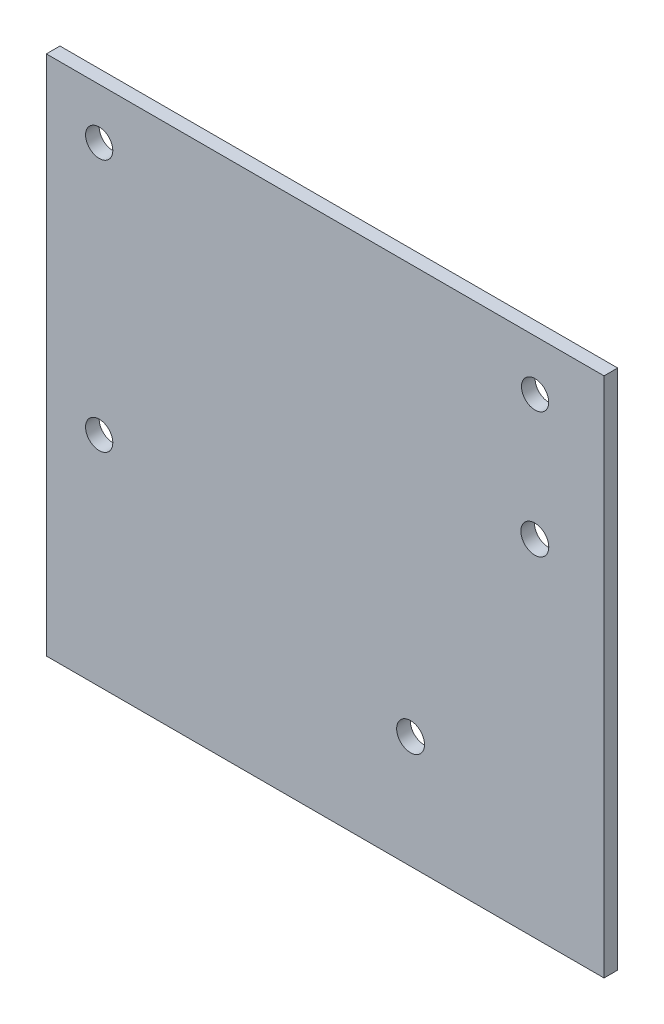
ISO-10303-21;
HEADER;
FILE_DESCRIPTION(('STEP AP214'),'2;1');
FILE_NAME('part.step','',(''),(''),'','','');
FILE_SCHEMA(('AUTOMOTIVE_DESIGN { 1 0 10303 214 1 1 1 1 }'));
ENDSEC;
DATA;
#1=APPLICATION_CONTEXT('core data for automotive mechanical design processes');
#2=APPLICATION_PROTOCOL_DEFINITION('international standard','automotive_design',2000,#1);
#3=PRODUCT_CONTEXT('',#1,'mechanical');
#4=PRODUCT('Part','Part','',(#3));
#5=PRODUCT_RELATED_PRODUCT_CATEGORY('part','',(#4));
#6=PRODUCT_DEFINITION_FORMATION('','',#4);
#7=PRODUCT_DEFINITION_CONTEXT('part definition',#1,'design');
#8=PRODUCT_DEFINITION('design','',#6,#7);
#9=PRODUCT_DEFINITION_SHAPE('','',#8);
#10=(LENGTH_UNIT() NAMED_UNIT(*) SI_UNIT(.MILLI.,.METRE.));
#11=(NAMED_UNIT(*) PLANE_ANGLE_UNIT() SI_UNIT($,.RADIAN.));
#12=(NAMED_UNIT(*) SI_UNIT($,.STERADIAN.) SOLID_ANGLE_UNIT());
#13=UNCERTAINTY_MEASURE_WITH_UNIT(LENGTH_MEASURE(1.E-05),#10,'distance_accuracy_value','');
#14=(GEOMETRIC_REPRESENTATION_CONTEXT(3) GLOBAL_UNCERTAINTY_ASSIGNED_CONTEXT((#13)) GLOBAL_UNIT_ASSIGNED_CONTEXT((#10,
#11,#12)) REPRESENTATION_CONTEXT('',''));
#15=CARTESIAN_POINT('',(0.,0.,0.));
#16=DIRECTION('',(0.,0.,1.));
#17=DIRECTION('',(1.,0.,0.));
#18=AXIS2_PLACEMENT_3D('',#15,#16,#17);
#19=CARTESIAN_POINT('',(0.,0.,3.175));
#20=DIRECTION('',(0.,0.,1.));
#21=DIRECTION('',(1.,0.,0.));
#22=AXIS2_PLACEMENT_3D('',#19,#20,#21);
#23=PLANE('',#22);
#24=CARTESIAN_POINT('',(76.1326491133236,265.583474470695,3.175));
#25=DIRECTION('',(0.,0.,1.));
#26=DIRECTION('',(1.,0.,0.));
#27=AXIS2_PLACEMENT_3D('',#24,#25,#26);
#28=CIRCLE('',#27,3.25119999999999);
#29=CARTESIAN_POINT('',(79.3838491133236,265.583474470695,3.175));
#30=VERTEX_POINT('',#29);
#31=EDGE_CURVE('E133',#30,#30,#28,.T.);
#32=ORIENTED_EDGE('',*,*,#31,.F.);
#33=EDGE_LOOP('',(#32));
#34=FACE_BOUND('',#33,.T.);
#35=CARTESIAN_POINT('',(-25.400000000001,294.821428571428,3.175));
#36=DIRECTION('',(0.,0.,1.));
#37=DIRECTION('',(1.,0.,0.));
#38=AXIS2_PLACEMENT_3D('',#35,#36,#37);
#39=CIRCLE('',#38,3.175);
#40=CARTESIAN_POINT('',(-22.225000000001,294.821428571428,3.175));
#41=VERTEX_POINT('',#40);
#42=EDGE_CURVE('E121',#41,#41,#39,.T.);
#43=ORIENTED_EDGE('',*,*,#42,.F.);
#44=EDGE_LOOP('',(#43));
#45=FACE_BOUND('',#44,.T.);
#46=DIRECTION('',(0.,-1.,0.));
#47=VECTOR('',#46,1.);
#48=CARTESIAN_POINT('',(-37.7160104919767,306.595912380857,3.175));
#49=LINE('',#48,#47);
#50=CARTESIAN_POINT('',(-37.7160104919767,306.595912380857,3.175));
#51=VERTEX_POINT('',#50);
#52=CARTESIAN_POINT('',(-37.7160104919767,185.057142857143,3.175));
#53=VERTEX_POINT('',#52);
#54=EDGE_CURVE('E91',#51,#53,#49,.T.);
#55=ORIENTED_EDGE('',*,*,#54,.T.);
#56=DIRECTION('',(1.,0.,0.));
#57=VECTOR('',#56,1.);
#58=CARTESIAN_POINT('',(-37.7160104919767,185.057142857143,3.175));
#59=LINE('',#58,#57);
#60=CARTESIAN_POINT('',(92.2640408831628,185.057142857143,3.175));
#61=VERTEX_POINT('',#60);
#62=EDGE_CURVE('E86',#53,#61,#59,.T.);
#63=ORIENTED_EDGE('',*,*,#62,.T.);
#64=DIRECTION('',(0.,1.,0.));
#65=VECTOR('',#64,1.);
#66=CARTESIAN_POINT('',(92.2640408831627,306.595912380857,3.175));
#67=LINE('',#66,#65);
#68=CARTESIAN_POINT('',(92.2640408831627,306.595912380857,3.175));
#69=VERTEX_POINT('',#68);
#70=EDGE_CURVE('E89',#61,#69,#67,.T.);
#71=ORIENTED_EDGE('',*,*,#70,.T.);
#72=DIRECTION('',(-1.,0.,0.));
#73=VECTOR('',#72,1.);
#74=CARTESIAN_POINT('',(-37.7160104919767,306.595912380857,3.175));
#75=LINE('',#74,#73);
#76=EDGE_CURVE('E56',#69,#51,#75,.T.);
#77=ORIENTED_EDGE('',*,*,#76,.T.);
#78=EDGE_LOOP('',(#55,#63,#71,#77));
#79=FACE_BOUND('',#78,.T.);
#80=CARTESIAN_POINT('',(-25.4000000000008,235.857142857143,3.175));
#81=DIRECTION('',(0.,0.,1.));
#82=DIRECTION('',(1.,0.,0.));
#83=AXIS2_PLACEMENT_3D('',#80,#81,#82);
#84=CIRCLE('',#83,3.175);
#85=CARTESIAN_POINT('',(-22.2250000000008,235.857142857143,3.175));
#86=VERTEX_POINT('',#85);
#87=EDGE_CURVE('E106',#86,#86,#84,.T.);
#88=ORIENTED_EDGE('',*,*,#87,.F.);
#89=EDGE_LOOP('',(#88));
#90=FACE_BOUND('',#89,.T.);
#91=CARTESIAN_POINT('',(76.199999999999,294.821428571429,3.175));
#92=DIRECTION('',(0.,0.,1.));
#93=DIRECTION('',(1.,0.,0.));
#94=AXIS2_PLACEMENT_3D('',#91,#92,#93);
#95=CIRCLE('',#94,3.175);
#96=CARTESIAN_POINT('',(79.374999999999,294.821428571429,3.175));
#97=VERTEX_POINT('',#96);
#98=EDGE_CURVE('E127',#97,#97,#95,.T.);
#99=ORIENTED_EDGE('',*,*,#98,.F.);
#100=EDGE_LOOP('',(#99));
#101=FACE_BOUND('',#100,.T.);
#102=CARTESIAN_POINT('',(47.1766491133236,211.227474470695,3.175));
#103=DIRECTION('',(0.,0.,1.));
#104=DIRECTION('',(1.,0.,0.));
#105=AXIS2_PLACEMENT_3D('',#102,#103,#104);
#106=CIRCLE('',#105,3.25119999999999);
#107=CARTESIAN_POINT('',(50.4278491133236,211.227474470695,3.175));
#108=VERTEX_POINT('',#107);
#109=EDGE_CURVE('E139',#108,#108,#106,.T.);
#110=ORIENTED_EDGE('',*,*,#109,.F.);
#111=EDGE_LOOP('',(#110));
#112=FACE_BOUND('',#111,.T.);
#113=ADVANCED_FACE('F39',(#34,#45,#79,#90,#101,#112),#23,.T.);
#114=CARTESIAN_POINT('',(0.,0.,0.));
#115=DIRECTION('',(0.,0.,1.));
#116=DIRECTION('',(1.,0.,0.));
#117=AXIS2_PLACEMENT_3D('',#114,#115,#116);
#118=PLANE('',#117);
#119=DIRECTION('',(0.,-1.,0.));
#120=VECTOR('',#119,1.);
#121=CARTESIAN_POINT('',(-37.7160104919767,306.595912380857,0.));
#122=LINE('',#121,#120);
#123=CARTESIAN_POINT('',(-37.7160104919767,306.595912380857,0.));
#124=VERTEX_POINT('',#123);
#125=CARTESIAN_POINT('',(-37.7160104919767,185.057142857143,0.));
#126=VERTEX_POINT('',#125);
#127=EDGE_CURVE('E103',#124,#126,#122,.T.);
#128=ORIENTED_EDGE('',*,*,#127,.F.);
#129=DIRECTION('',(-1.,0.,0.));
#130=VECTOR('',#129,1.);
#131=CARTESIAN_POINT('',(-37.7160104919767,306.595912380857,0.));
#132=LINE('',#131,#130);
#133=CARTESIAN_POINT('',(92.2640408831627,306.595912380857,0.));
#134=VERTEX_POINT('',#133);
#135=EDGE_CURVE('E79',#134,#124,#132,.T.);
#136=ORIENTED_EDGE('',*,*,#135,.F.);
#137=DIRECTION('',(0.,1.,0.));
#138=VECTOR('',#137,1.);
#139=CARTESIAN_POINT('',(92.2640408831627,306.595912380857,0.));
#140=LINE('',#139,#138);
#141=CARTESIAN_POINT('',(92.2640408831628,185.057142857143,0.));
#142=VERTEX_POINT('',#141);
#143=EDGE_CURVE('E73',#142,#134,#140,.T.);
#144=ORIENTED_EDGE('',*,*,#143,.F.);
#145=DIRECTION('',(1.,0.,0.));
#146=VECTOR('',#145,1.);
#147=CARTESIAN_POINT('',(-37.7160104919767,185.057142857143,0.));
#148=LINE('',#147,#146);
#149=EDGE_CURVE('E95',#126,#142,#148,.T.);
#150=ORIENTED_EDGE('',*,*,#149,.F.);
#151=EDGE_LOOP('',(#128,#136,#144,#150));
#152=FACE_BOUND('',#151,.T.);
#153=CARTESIAN_POINT('',(-25.4000000000008,235.857142857143,0.));
#154=DIRECTION('',(0.,0.,1.));
#155=DIRECTION('',(1.,0.,0.));
#156=AXIS2_PLACEMENT_3D('',#153,#154,#155);
#157=CIRCLE('',#156,3.175);
#158=CARTESIAN_POINT('',(-22.2250000000008,235.857142857143,0.));
#159=VERTEX_POINT('',#158);
#160=EDGE_CURVE('E118',#159,#159,#157,.T.);
#161=ORIENTED_EDGE('',*,*,#160,.T.);
#162=EDGE_LOOP('',(#161));
#163=FACE_BOUND('',#162,.T.);
#164=CARTESIAN_POINT('',(-25.400000000001,294.821428571428,0.));
#165=DIRECTION('',(0.,0.,1.));
#166=DIRECTION('',(1.,0.,0.));
#167=AXIS2_PLACEMENT_3D('',#164,#165,#166);
#168=CIRCLE('',#167,3.175);
#169=CARTESIAN_POINT('',(-22.225000000001,294.821428571428,0.));
#170=VERTEX_POINT('',#169);
#171=EDGE_CURVE('E124',#170,#170,#168,.T.);
#172=ORIENTED_EDGE('',*,*,#171,.T.);
#173=EDGE_LOOP('',(#172));
#174=FACE_BOUND('',#173,.T.);
#175=CARTESIAN_POINT('',(76.199999999999,294.821428571429,0.));
#176=DIRECTION('',(0.,0.,1.));
#177=DIRECTION('',(1.,0.,0.));
#178=AXIS2_PLACEMENT_3D('',#175,#176,#177);
#179=CIRCLE('',#178,3.175);
#180=CARTESIAN_POINT('',(79.374999999999,294.821428571429,0.));
#181=VERTEX_POINT('',#180);
#182=EDGE_CURVE('E130',#181,#181,#179,.T.);
#183=ORIENTED_EDGE('',*,*,#182,.T.);
#184=EDGE_LOOP('',(#183));
#185=FACE_BOUND('',#184,.T.);
#186=CARTESIAN_POINT('',(76.1326491133236,265.583474470695,0.));
#187=DIRECTION('',(0.,0.,1.));
#188=DIRECTION('',(1.,0.,0.));
#189=AXIS2_PLACEMENT_3D('',#186,#187,#188);
#190=CIRCLE('',#189,3.25119999999999);
#191=CARTESIAN_POINT('',(79.3838491133236,265.583474470695,0.));
#192=VERTEX_POINT('',#191);
#193=EDGE_CURVE('E136',#192,#192,#190,.T.);
#194=ORIENTED_EDGE('',*,*,#193,.T.);
#195=EDGE_LOOP('',(#194));
#196=FACE_BOUND('',#195,.T.);
#197=CARTESIAN_POINT('',(47.1766491133236,211.227474470695,0.));
#198=DIRECTION('',(0.,0.,1.));
#199=DIRECTION('',(1.,0.,0.));
#200=AXIS2_PLACEMENT_3D('',#197,#198,#199);
#201=CIRCLE('',#200,3.25119999999999);
#202=CARTESIAN_POINT('',(50.4278491133236,211.227474470695,0.));
#203=VERTEX_POINT('',#202);
#204=EDGE_CURVE('E142',#203,#203,#201,.T.);
#205=ORIENTED_EDGE('',*,*,#204,.T.);
#206=EDGE_LOOP('',(#205));
#207=FACE_BOUND('',#206,.T.);
#208=ADVANCED_FACE('F114',(#152,#163,#174,#185,#196,#207),#118,.F.);
#209=CARTESIAN_POINT('',(-37.7160104919767,306.595912380857,3.175));
#210=DIRECTION('',(1.,0.,0.));
#211=DIRECTION('',(0.,1.,0.));
#212=AXIS2_PLACEMENT_3D('',#209,#210,#211);
#213=PLANE('',#212);
#214=ORIENTED_EDGE('',*,*,#127,.T.);
#215=DIRECTION('',(0.,0.,-1.));
#216=VECTOR('',#215,1.);
#217=CARTESIAN_POINT('',(-37.7160104919767,185.057142857143,3.175));
#218=LINE('',#217,#216);
#219=EDGE_CURVE('E11',#53,#126,#218,.T.);
#220=ORIENTED_EDGE('',*,*,#219,.F.);
#221=ORIENTED_EDGE('',*,*,#54,.F.);
#222=DIRECTION('',(0.,0.,-1.));
#223=VECTOR('',#222,1.);
#224=CARTESIAN_POINT('',(-37.7160104919767,306.595912380857,3.175));
#225=LINE('',#224,#223);
#226=EDGE_CURVE('E99',#51,#124,#225,.T.);
#227=ORIENTED_EDGE('',*,*,#226,.T.);
#228=EDGE_LOOP('',(#214,#220,#221,#227));
#229=FACE_BOUND('',#228,.T.);
#230=ADVANCED_FACE('F41',(#229),#213,.F.);
#231=CARTESIAN_POINT('',(-37.7160104919767,185.057142857143,3.175));
#232=DIRECTION('',(0.,1.,0.));
#233=DIRECTION('',(0.,0.,1.));
#234=AXIS2_PLACEMENT_3D('',#231,#232,#233);
#235=PLANE('',#234);
#236=ORIENTED_EDGE('',*,*,#149,.T.);
#237=DIRECTION('',(0.,0.,-1.));
#238=VECTOR('',#237,1.);
#239=CARTESIAN_POINT('',(92.2640408831628,185.057142857143,3.175));
#240=LINE('',#239,#238);
#241=EDGE_CURVE('E48',#61,#142,#240,.T.);
#242=ORIENTED_EDGE('',*,*,#241,.F.);
#243=ORIENTED_EDGE('',*,*,#62,.F.);
#244=ORIENTED_EDGE('',*,*,#219,.T.);
#245=EDGE_LOOP('',(#236,#242,#243,#244));
#246=FACE_BOUND('',#245,.T.);
#247=ADVANCED_FACE('F94',(#246),#235,.F.);
#248=CARTESIAN_POINT('',(92.2640408831627,306.595912380857,3.175));
#249=DIRECTION('',(-1.,0.,0.));
#250=DIRECTION('',(0.,-1.,0.));
#251=AXIS2_PLACEMENT_3D('',#248,#249,#250);
#252=PLANE('',#251);
#253=ORIENTED_EDGE('',*,*,#143,.T.);
#254=DIRECTION('',(0.,0.,-1.));
#255=VECTOR('',#254,1.);
#256=CARTESIAN_POINT('',(92.2640408831627,306.595912380857,3.175));
#257=LINE('',#256,#255);
#258=EDGE_CURVE('E96',#69,#134,#257,.T.);
#259=ORIENTED_EDGE('',*,*,#258,.F.);
#260=ORIENTED_EDGE('',*,*,#70,.F.);
#261=ORIENTED_EDGE('',*,*,#241,.T.);
#262=EDGE_LOOP('',(#253,#259,#260,#261));
#263=FACE_BOUND('',#262,.T.);
#264=ADVANCED_FACE('F97',(#263),#252,.F.);
#265=CARTESIAN_POINT('',(-37.7160104919767,306.595912380857,3.175));
#266=DIRECTION('',(0.,-1.,0.));
#267=DIRECTION('',(0.,0.,-1.));
#268=AXIS2_PLACEMENT_3D('',#265,#266,#267);
#269=PLANE('',#268);
#270=ORIENTED_EDGE('',*,*,#135,.T.);
#271=ORIENTED_EDGE('',*,*,#226,.F.);
#272=ORIENTED_EDGE('',*,*,#76,.F.);
#273=ORIENTED_EDGE('',*,*,#258,.T.);
#274=EDGE_LOOP('',(#270,#271,#272,#273));
#275=FACE_BOUND('',#274,.T.);
#276=ADVANCED_FACE('F111',(#275),#269,.F.);
#277=CARTESIAN_POINT('',(-25.4000000000008,235.857142857143,3.175));
#278=DIRECTION('',(0.,0.,-1.));
#279=DIRECTION('',(-1.,0.,0.));
#280=AXIS2_PLACEMENT_3D('',#277,#278,#279);
#281=CYLINDRICAL_SURFACE('',#280,3.175);
#282=ORIENTED_EDGE('',*,*,#87,.T.);
#283=EDGE_LOOP('',(#282));
#284=FACE_BOUND('',#283,.T.);
#285=ORIENTED_EDGE('',*,*,#160,.F.);
#286=EDGE_LOOP('',(#285));
#287=FACE_BOUND('',#286,.T.);
#288=ADVANCED_FACE('F161',(#284,#287),#281,.F.);
#289=CARTESIAN_POINT('',(-25.400000000001,294.821428571428,3.175));
#290=DIRECTION('',(0.,0.,-1.));
#291=DIRECTION('',(-1.,0.,0.));
#292=AXIS2_PLACEMENT_3D('',#289,#290,#291);
#293=CYLINDRICAL_SURFACE('',#292,3.175);
#294=ORIENTED_EDGE('',*,*,#42,.T.);
#295=EDGE_LOOP('',(#294));
#296=FACE_BOUND('',#295,.T.);
#297=ORIENTED_EDGE('',*,*,#171,.F.);
#298=EDGE_LOOP('',(#297));
#299=FACE_BOUND('',#298,.T.);
#300=ADVANCED_FACE('F206',(#296,#299),#293,.F.);
#301=CARTESIAN_POINT('',(76.199999999999,294.821428571429,3.175));
#302=DIRECTION('',(0.,0.,-1.));
#303=DIRECTION('',(-1.,0.,0.));
#304=AXIS2_PLACEMENT_3D('',#301,#302,#303);
#305=CYLINDRICAL_SURFACE('',#304,3.175);
#306=ORIENTED_EDGE('',*,*,#98,.T.);
#307=EDGE_LOOP('',(#306));
#308=FACE_BOUND('',#307,.T.);
#309=ORIENTED_EDGE('',*,*,#182,.F.);
#310=EDGE_LOOP('',(#309));
#311=FACE_BOUND('',#310,.T.);
#312=ADVANCED_FACE('F214',(#308,#311),#305,.F.);
#313=CARTESIAN_POINT('',(76.1326491133236,265.583474470695,3.175));
#314=DIRECTION('',(0.,0.,-1.));
#315=DIRECTION('',(-1.,0.,0.));
#316=AXIS2_PLACEMENT_3D('',#313,#314,#315);
#317=CYLINDRICAL_SURFACE('',#316,3.25119999999999);
#318=ORIENTED_EDGE('',*,*,#31,.T.);
#319=EDGE_LOOP('',(#318));
#320=FACE_BOUND('',#319,.T.);
#321=ORIENTED_EDGE('',*,*,#193,.F.);
#322=EDGE_LOOP('',(#321));
#323=FACE_BOUND('',#322,.T.);
#324=ADVANCED_FACE('F222',(#320,#323),#317,.F.);
#325=CARTESIAN_POINT('',(47.1766491133236,211.227474470695,3.175));
#326=DIRECTION('',(0.,0.,-1.));
#327=DIRECTION('',(-1.,0.,0.));
#328=AXIS2_PLACEMENT_3D('',#325,#326,#327);
#329=CYLINDRICAL_SURFACE('',#328,3.25119999999999);
#330=ORIENTED_EDGE('',*,*,#109,.T.);
#331=EDGE_LOOP('',(#330));
#332=FACE_BOUND('',#331,.T.);
#333=ORIENTED_EDGE('',*,*,#204,.F.);
#334=EDGE_LOOP('',(#333));
#335=FACE_BOUND('',#334,.T.);
#336=ADVANCED_FACE('F148',(#332,#335),#329,.F.);
#337=CLOSED_SHELL('',(#113,#208,#230,#247,#264,#276,#288,#300,#312,#324,#336));
#338=MANIFOLD_SOLID_BREP('B2',#337);
#339=ADVANCED_BREP_SHAPE_REPRESENTATION('',(#18,#338),#14);
#340=SHAPE_DEFINITION_REPRESENTATION(#9,#339);
ENDSEC;
END-ISO-10303-21;
